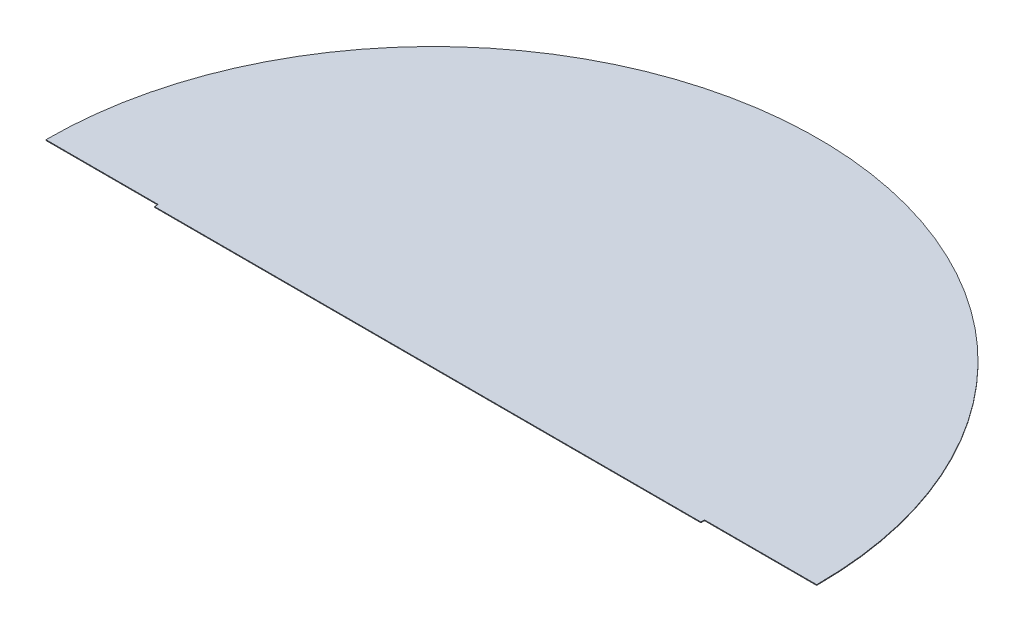
ISO-10303-21;
HEADER;
FILE_DESCRIPTION(('STEP AP214'),'2;1');
FILE_NAME('part.step','',(''),(''),'','','');
FILE_SCHEMA(('AUTOMOTIVE_DESIGN { 1 0 10303 214 1 1 1 1 }'));
ENDSEC;
DATA;
#1=APPLICATION_CONTEXT('core data for automotive mechanical design processes');
#2=APPLICATION_PROTOCOL_DEFINITION('international standard','automotive_design',2000,#1);
#3=PRODUCT_CONTEXT('',#1,'mechanical');
#4=PRODUCT('Part','Part','',(#3));
#5=PRODUCT_RELATED_PRODUCT_CATEGORY('part','',(#4));
#6=PRODUCT_DEFINITION_FORMATION('','',#4);
#7=PRODUCT_DEFINITION_CONTEXT('part definition',#1,'design');
#8=PRODUCT_DEFINITION('design','',#6,#7);
#9=PRODUCT_DEFINITION_SHAPE('','',#8);
#10=(LENGTH_UNIT() NAMED_UNIT(*) SI_UNIT(.MILLI.,.METRE.));
#11=(NAMED_UNIT(*) PLANE_ANGLE_UNIT() SI_UNIT($,.RADIAN.));
#12=(NAMED_UNIT(*) SI_UNIT($,.STERADIAN.) SOLID_ANGLE_UNIT());
#13=UNCERTAINTY_MEASURE_WITH_UNIT(LENGTH_MEASURE(1.E-05),#10,'distance_accuracy_value','');
#14=(GEOMETRIC_REPRESENTATION_CONTEXT(3) GLOBAL_UNCERTAINTY_ASSIGNED_CONTEXT((#13)) GLOBAL_UNIT_ASSIGNED_CONTEXT((#10,
#11,#12)) REPRESENTATION_CONTEXT('',''));
#15=CARTESIAN_POINT('',(0.,0.,0.));
#16=DIRECTION('',(0.,0.,1.));
#17=DIRECTION('',(1.,0.,0.));
#18=AXIS2_PLACEMENT_3D('',#15,#16,#17);
#19=CARTESIAN_POINT('',(1065.,2.,0.));
#20=DIRECTION('',(0.,-1.,0.));
#21=DIRECTION('',(0.,0.,-1.));
#22=AXIS2_PLACEMENT_3D('',#19,#20,#21);
#23=CYLINDRICAL_SURFACE('',#22,1065.);
#24=CARTESIAN_POINT('',(1065.,0.,0.));
#25=DIRECTION('',(0.,1.,0.));
#26=DIRECTION('',(0.,0.,-1.));
#27=AXIS2_PLACEMENT_3D('',#24,#25,#26);
#28=CIRCLE('',#27,1065.);
#29=CARTESIAN_POINT('',(2130.,0.,0.));
#30=VERTEX_POINT('',#29);
#31=CARTESIAN_POINT('',(0.,0.,0.));
#32=VERTEX_POINT('',#31);
#33=EDGE_CURVE('E140',#30,#32,#28,.T.);
#34=ORIENTED_EDGE('',*,*,#33,.T.);
#35=DIRECTION('',(0.,-1.,0.));
#36=VECTOR('',#35,1.);
#37=CARTESIAN_POINT('',(0.,2.,0.));
#38=LINE('',#37,#36);
#39=CARTESIAN_POINT('',(0.,2.,0.));
#40=VERTEX_POINT('',#39);
#41=EDGE_CURVE('E11',#40,#32,#38,.T.);
#42=ORIENTED_EDGE('',*,*,#41,.F.);
#43=CARTESIAN_POINT('',(1065.,2.,0.));
#44=DIRECTION('',(0.,1.,0.));
#45=DIRECTION('',(0.,0.,-1.));
#46=AXIS2_PLACEMENT_3D('',#43,#44,#45);
#47=CIRCLE('',#46,1065.);
#48=CARTESIAN_POINT('',(2130.,2.,0.));
#49=VERTEX_POINT('',#48);
#50=EDGE_CURVE('E162',#49,#40,#47,.T.);
#51=ORIENTED_EDGE('',*,*,#50,.F.);
#52=DIRECTION('',(0.,-1.,0.));
#53=VECTOR('',#52,1.);
#54=CARTESIAN_POINT('',(2130.,2.,0.));
#55=LINE('',#54,#53);
#56=EDGE_CURVE('E136',#49,#30,#55,.T.);
#57=ORIENTED_EDGE('',*,*,#56,.T.);
#58=EDGE_LOOP('',(#34,#42,#51,#57));
#59=FACE_BOUND('',#58,.T.);
#60=ADVANCED_FACE('F39',(#59),#23,.T.);
#61=CARTESIAN_POINT('',(0.,2.,0.));
#62=DIRECTION('',(1.,0.,0.));
#63=DIRECTION('',(0.,0.,-1.));
#64=AXIS2_PLACEMENT_3D('',#61,#62,#63);
#65=PLANE('',#64);
#66=DIRECTION('',(0.,0.,1.));
#67=VECTOR('',#66,1.);
#68=CARTESIAN_POINT('',(0.,0.,0.));
#69=LINE('',#68,#67);
#70=CARTESIAN_POINT('',(0.,0.,5.));
#71=VERTEX_POINT('',#70);
#72=EDGE_CURVE('E144',#32,#71,#69,.T.);
#73=ORIENTED_EDGE('',*,*,#72,.T.);
#74=DIRECTION('',(0.,-1.,0.));
#75=VECTOR('',#74,1.);
#76=CARTESIAN_POINT('',(0.,2.,5.));
#77=LINE('',#76,#75);
#78=CARTESIAN_POINT('',(0.,2.,5.));
#79=VERTEX_POINT('',#78);
#80=EDGE_CURVE('E48',#79,#71,#77,.T.);
#81=ORIENTED_EDGE('',*,*,#80,.F.);
#82=DIRECTION('',(0.,0.,1.));
#83=VECTOR('',#82,1.);
#84=CARTESIAN_POINT('',(0.,2.,0.));
#85=LINE('',#84,#83);
#86=EDGE_CURVE('E99',#40,#79,#85,.T.);
#87=ORIENTED_EDGE('',*,*,#86,.F.);
#88=ORIENTED_EDGE('',*,*,#41,.T.);
#89=EDGE_LOOP('',(#73,#81,#87,#88));
#90=FACE_BOUND('',#89,.T.);
#91=ADVANCED_FACE('F208',(#90),#65,.F.);
#92=CARTESIAN_POINT('',(0.,2.,5.));
#93=DIRECTION('',(0.,0.,-1.));
#94=DIRECTION('',(-1.,0.,0.));
#95=AXIS2_PLACEMENT_3D('',#92,#93,#94);
#96=PLANE('',#95);
#97=DIRECTION('',(1.,0.,0.));
#98=VECTOR('',#97,1.);
#99=CARTESIAN_POINT('',(0.,0.,5.));
#100=LINE('',#99,#98);
#101=CARTESIAN_POINT('',(310.,0.,5.));
#102=VERTEX_POINT('',#101);
#103=EDGE_CURVE('E147',#71,#102,#100,.T.);
#104=ORIENTED_EDGE('',*,*,#103,.T.);
#105=DIRECTION('',(0.,-1.,0.));
#106=VECTOR('',#105,1.);
#107=CARTESIAN_POINT('',(310.,2.,5.));
#108=LINE('',#107,#106);
#109=CARTESIAN_POINT('',(310.,2.,5.));
#110=VERTEX_POINT('',#109);
#111=EDGE_CURVE('E173',#110,#102,#108,.T.);
#112=ORIENTED_EDGE('',*,*,#111,.F.);
#113=DIRECTION('',(1.,0.,0.));
#114=VECTOR('',#113,1.);
#115=CARTESIAN_POINT('',(0.,2.,5.));
#116=LINE('',#115,#114);
#117=EDGE_CURVE('E183',#79,#110,#116,.T.);
#118=ORIENTED_EDGE('',*,*,#117,.F.);
#119=ORIENTED_EDGE('',*,*,#80,.T.);
#120=EDGE_LOOP('',(#104,#112,#118,#119));
#121=FACE_BOUND('',#120,.T.);
#122=ADVANCED_FACE('F181',(#121),#96,.F.);
#123=CARTESIAN_POINT('',(310.,2.,15.0000000000003));
#124=DIRECTION('',(1.,0.,0.));
#125=DIRECTION('',(0.,0.,-1.));
#126=AXIS2_PLACEMENT_3D('',#123,#124,#125);
#127=PLANE('',#126);
#128=DIRECTION('',(0.,0.,1.));
#129=VECTOR('',#128,1.);
#130=CARTESIAN_POINT('',(310.,0.,15.0000000000003));
#131=LINE('',#130,#129);
#132=CARTESIAN_POINT('',(310.,0.,15.0000000000003));
#133=VERTEX_POINT('',#132);
#134=EDGE_CURVE('E150',#102,#133,#131,.T.);
#135=ORIENTED_EDGE('',*,*,#134,.T.);
#136=DIRECTION('',(0.,-1.,0.));
#137=VECTOR('',#136,1.);
#138=CARTESIAN_POINT('',(310.,2.,15.0000000000003));
#139=LINE('',#138,#137);
#140=CARTESIAN_POINT('',(310.,2.,15.0000000000003));
#141=VERTEX_POINT('',#140);
#142=EDGE_CURVE('E169',#141,#133,#139,.T.);
#143=ORIENTED_EDGE('',*,*,#142,.F.);
#144=DIRECTION('',(0.,0.,1.));
#145=VECTOR('',#144,1.);
#146=CARTESIAN_POINT('',(310.,2.,15.0000000000003));
#147=LINE('',#146,#145);
#148=EDGE_CURVE('E196',#110,#141,#147,.T.);
#149=ORIENTED_EDGE('',*,*,#148,.F.);
#150=ORIENTED_EDGE('',*,*,#111,.T.);
#151=EDGE_LOOP('',(#135,#143,#149,#150));
#152=FACE_BOUND('',#151,.T.);
#153=ADVANCED_FACE('F191',(#152),#127,.F.);
#154=CARTESIAN_POINT('',(310.,2.,15.0000000000003));
#155=DIRECTION('',(0.,0.,-1.));
#156=DIRECTION('',(-1.,0.,0.));
#157=AXIS2_PLACEMENT_3D('',#154,#155,#156);
#158=PLANE('',#157);
#159=DIRECTION('',(1.,0.,0.));
#160=VECTOR('',#159,1.);
#161=CARTESIAN_POINT('',(310.,0.,15.0000000000003));
#162=LINE('',#161,#160);
#163=CARTESIAN_POINT('',(1820.,0.,15.));
#164=VERTEX_POINT('',#163);
#165=EDGE_CURVE('E153',#133,#164,#162,.T.);
#166=ORIENTED_EDGE('',*,*,#165,.T.);
#167=DIRECTION('',(0.,-1.,0.));
#168=VECTOR('',#167,1.);
#169=CARTESIAN_POINT('',(1820.,2.,15.));
#170=LINE('',#169,#168);
#171=CARTESIAN_POINT('',(1820.,2.,15.));
#172=VERTEX_POINT('',#171);
#173=EDGE_CURVE('E129',#172,#164,#170,.T.);
#174=ORIENTED_EDGE('',*,*,#173,.F.);
#175=DIRECTION('',(1.,0.,0.));
#176=VECTOR('',#175,1.);
#177=CARTESIAN_POINT('',(310.,2.,15.0000000000003));
#178=LINE('',#177,#176);
#179=EDGE_CURVE('E118',#141,#172,#178,.T.);
#180=ORIENTED_EDGE('',*,*,#179,.F.);
#181=ORIENTED_EDGE('',*,*,#142,.T.);
#182=EDGE_LOOP('',(#166,#174,#180,#181));
#183=FACE_BOUND('',#182,.T.);
#184=ADVANCED_FACE('F194',(#183),#158,.F.);
#185=CARTESIAN_POINT('',(1820.,2.,15.));
#186=DIRECTION('',(-1.,0.,0.));
#187=DIRECTION('',(0.,0.,1.));
#188=AXIS2_PLACEMENT_3D('',#185,#186,#187);
#189=PLANE('',#188);
#190=DIRECTION('',(0.,0.,-1.));
#191=VECTOR('',#190,1.);
#192=CARTESIAN_POINT('',(1820.,0.,15.));
#193=LINE('',#192,#191);
#194=CARTESIAN_POINT('',(1820.,0.,5.00000000000004));
#195=VERTEX_POINT('',#194);
#196=EDGE_CURVE('E127',#164,#195,#193,.T.);
#197=ORIENTED_EDGE('',*,*,#196,.T.);
#198=DIRECTION('',(0.,-1.,0.));
#199=VECTOR('',#198,1.);
#200=CARTESIAN_POINT('',(1820.,2.,5.00000000000004));
#201=LINE('',#200,#199);
#202=CARTESIAN_POINT('',(1820.,2.,5.00000000000004));
#203=VERTEX_POINT('',#202);
#204=EDGE_CURVE('E124',#203,#195,#201,.T.);
#205=ORIENTED_EDGE('',*,*,#204,.F.);
#206=DIRECTION('',(0.,0.,-1.));
#207=VECTOR('',#206,1.);
#208=CARTESIAN_POINT('',(1820.,2.,15.));
#209=LINE('',#208,#207);
#210=EDGE_CURVE('E112',#172,#203,#209,.T.);
#211=ORIENTED_EDGE('',*,*,#210,.F.);
#212=ORIENTED_EDGE('',*,*,#173,.T.);
#213=EDGE_LOOP('',(#197,#205,#211,#212));
#214=FACE_BOUND('',#213,.T.);
#215=ADVANCED_FACE('F125',(#214),#189,.F.);
#216=CARTESIAN_POINT('',(2130.,2.,5.));
#217=DIRECTION('',(0.,0.,-1.));
#218=DIRECTION('',(-1.,0.,0.));
#219=AXIS2_PLACEMENT_3D('',#216,#217,#218);
#220=PLANE('',#219);
#221=DIRECTION('',(1.,0.,0.));
#222=VECTOR('',#221,1.);
#223=CARTESIAN_POINT('',(2130.,0.,5.));
#224=LINE('',#223,#222);
#225=CARTESIAN_POINT('',(2130.,0.,5.));
#226=VERTEX_POINT('',#225);
#227=EDGE_CURVE('E85',#195,#226,#224,.T.);
#228=ORIENTED_EDGE('',*,*,#227,.T.);
#229=DIRECTION('',(0.,-1.,0.));
#230=VECTOR('',#229,1.);
#231=CARTESIAN_POINT('',(2130.,2.,5.));
#232=LINE('',#231,#230);
#233=CARTESIAN_POINT('',(2130.,2.,5.));
#234=VERTEX_POINT('',#233);
#235=EDGE_CURVE('E130',#234,#226,#232,.T.);
#236=ORIENTED_EDGE('',*,*,#235,.F.);
#237=DIRECTION('',(1.,0.,0.));
#238=VECTOR('',#237,1.);
#239=CARTESIAN_POINT('',(2130.,2.,5.));
#240=LINE('',#239,#238);
#241=EDGE_CURVE('E116',#203,#234,#240,.T.);
#242=ORIENTED_EDGE('',*,*,#241,.F.);
#243=ORIENTED_EDGE('',*,*,#204,.T.);
#244=EDGE_LOOP('',(#228,#236,#242,#243));
#245=FACE_BOUND('',#244,.T.);
#246=ADVANCED_FACE('F132',(#245),#220,.F.);
#247=CARTESIAN_POINT('',(2130.,2.,5.));
#248=DIRECTION('',(-1.,0.,0.));
#249=DIRECTION('',(0.,0.,1.));
#250=AXIS2_PLACEMENT_3D('',#247,#248,#249);
#251=PLANE('',#250);
#252=DIRECTION('',(0.,0.,-1.));
#253=VECTOR('',#252,1.);
#254=CARTESIAN_POINT('',(2130.,0.,5.));
#255=LINE('',#254,#253);
#256=EDGE_CURVE('E91',#226,#30,#255,.T.);
#257=ORIENTED_EDGE('',*,*,#256,.T.);
#258=ORIENTED_EDGE('',*,*,#56,.F.);
#259=DIRECTION('',(0.,0.,-1.));
#260=VECTOR('',#259,1.);
#261=CARTESIAN_POINT('',(2130.,2.,5.));
#262=LINE('',#261,#260);
#263=EDGE_CURVE('E56',#234,#49,#262,.T.);
#264=ORIENTED_EDGE('',*,*,#263,.F.);
#265=ORIENTED_EDGE('',*,*,#235,.T.);
#266=EDGE_LOOP('',(#257,#258,#264,#265));
#267=FACE_BOUND('',#266,.T.);
#268=ADVANCED_FACE('F224',(#267),#251,.F.);
#269=CARTESIAN_POINT('',(1065.,2.,0.));
#270=DIRECTION('',(0.,-1.,0.));
#271=DIRECTION('',(0.,0.,-1.));
#272=AXIS2_PLACEMENT_3D('',#269,#270,#271);
#273=PLANE('',#272);
#274=ORIENTED_EDGE('',*,*,#50,.T.);
#275=ORIENTED_EDGE('',*,*,#86,.T.);
#276=ORIENTED_EDGE('',*,*,#117,.T.);
#277=ORIENTED_EDGE('',*,*,#148,.T.);
#278=ORIENTED_EDGE('',*,*,#179,.T.);
#279=ORIENTED_EDGE('',*,*,#210,.T.);
#280=ORIENTED_EDGE('',*,*,#241,.T.);
#281=ORIENTED_EDGE('',*,*,#263,.T.);
#282=EDGE_LOOP('',(#274,#275,#276,#277,#278,#279,#280,#281));
#283=FACE_BOUND('',#282,.T.);
#284=ADVANCED_FACE('F114',(#283),#273,.F.);
#285=CARTESIAN_POINT('',(1065.,0.,0.));
#286=DIRECTION('',(0.,-1.,0.));
#287=DIRECTION('',(0.,0.,-1.));
#288=AXIS2_PLACEMENT_3D('',#285,#286,#287);
#289=PLANE('',#288);
#290=ORIENTED_EDGE('',*,*,#33,.F.);
#291=ORIENTED_EDGE('',*,*,#256,.F.);
#292=ORIENTED_EDGE('',*,*,#227,.F.);
#293=ORIENTED_EDGE('',*,*,#196,.F.);
#294=ORIENTED_EDGE('',*,*,#165,.F.);
#295=ORIENTED_EDGE('',*,*,#134,.F.);
#296=ORIENTED_EDGE('',*,*,#103,.F.);
#297=ORIENTED_EDGE('',*,*,#72,.F.);
#298=EDGE_LOOP('',(#290,#291,#292,#293,#294,#295,#296,#297));
#299=FACE_BOUND('',#298,.T.);
#300=ADVANCED_FACE('F187',(#299),#289,.T.);
#301=CLOSED_SHELL('',(#60,#91,#122,#153,#184,#215,#246,#268,#284,#300));
#302=MANIFOLD_SOLID_BREP('B2',#301);
#303=ADVANCED_BREP_SHAPE_REPRESENTATION('',(#18,#302),#14);
#304=SHAPE_DEFINITION_REPRESENTATION(#9,#303);
ENDSEC;
END-ISO-10303-21;
